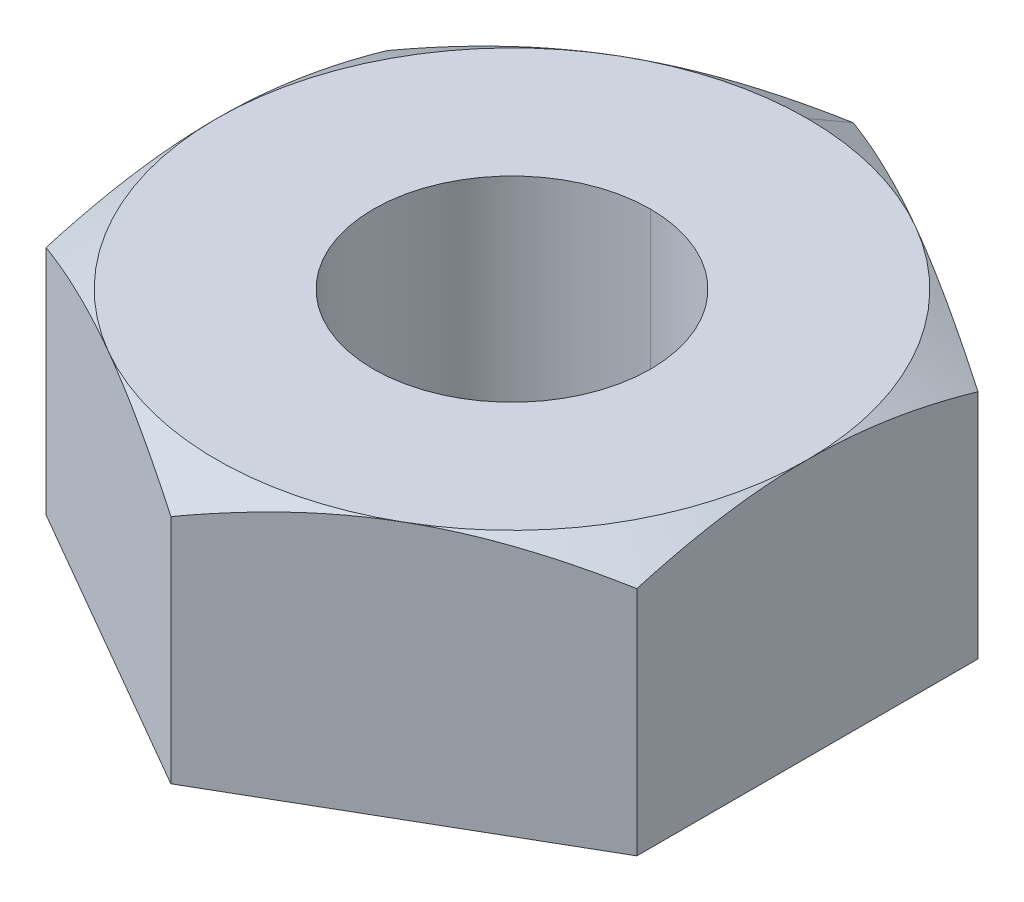
ISO-10303-21;
HEADER;
FILE_DESCRIPTION(('STEP AP214'),'2;1');
FILE_NAME('part.step','',(''),(''),'','','');
FILE_SCHEMA(('AUTOMOTIVE_DESIGN { 1 0 10303 214 1 1 1 1 }'));
ENDSEC;
DATA;
#1=APPLICATION_CONTEXT('core data for automotive mechanical design processes');
#2=APPLICATION_PROTOCOL_DEFINITION('international standard','automotive_design',2000,#1);
#3=PRODUCT_CONTEXT('',#1,'mechanical');
#4=PRODUCT('Part','Part','',(#3));
#5=PRODUCT_RELATED_PRODUCT_CATEGORY('part','',(#4));
#6=PRODUCT_DEFINITION_FORMATION('','',#4);
#7=PRODUCT_DEFINITION_CONTEXT('part definition',#1,'design');
#8=PRODUCT_DEFINITION('design','',#6,#7);
#9=PRODUCT_DEFINITION_SHAPE('','',#8);
#10=(LENGTH_UNIT() NAMED_UNIT(*) SI_UNIT(.MILLI.,.METRE.));
#11=(NAMED_UNIT(*) PLANE_ANGLE_UNIT() SI_UNIT($,.RADIAN.));
#12=(NAMED_UNIT(*) SI_UNIT($,.STERADIAN.) SOLID_ANGLE_UNIT());
#13=UNCERTAINTY_MEASURE_WITH_UNIT(LENGTH_MEASURE(1.E-05),#10,'distance_accuracy_value','');
#14=(GEOMETRIC_REPRESENTATION_CONTEXT(3) GLOBAL_UNCERTAINTY_ASSIGNED_CONTEXT((#13)) GLOBAL_UNIT_ASSIGNED_CONTEXT((#10,
#11,#12)) REPRESENTATION_CONTEXT('',''));
#15=CARTESIAN_POINT('',(0.,0.,0.));
#16=DIRECTION('',(0.,0.,1.));
#17=DIRECTION('',(1.,0.,0.));
#18=AXIS2_PLACEMENT_3D('',#15,#16,#17);
#19=CARTESIAN_POINT('',(0.,2.4,0.));
#20=DIRECTION('',(0.,-1.,0.));
#21=DIRECTION('',(0.,0.,-1.));
#22=AXIS2_PLACEMENT_3D('',#19,#20,#21);
#23=CONICAL_SURFACE('',#22,2.75,1.0471975511966);
#24=CARTESIAN_POINT('',(-1.375,2.4,2.38156986040721));
#25=CARTESIAN_POINT('',(-1.71537571429185,2.4,2.1850538501352));
#26=CARTESIAN_POINT('',(-2.07042661145691,2.33369548248392,1.98006511908093));
#27=CARTESIAN_POINT('',(-2.39248072027173,2.27355300018198,1.79412709266307));
#28=CARTESIAN_POINT('',(-2.75,2.15437990693814,1.58771324027148));
#29=B_SPLINE_CURVE_WITH_KNOTS('',2,(#24,#25,#26,#27,#28),.UNSPECIFIED.,.F.,.F.,(3,2,3),(0.,0.5,
1.),.UNSPECIFIED.);
#30=CARTESIAN_POINT('',(-1.375,2.4,2.38156986040721));
#31=VERTEX_POINT('',#30);
#32=CARTESIAN_POINT('',(-2.75,2.15437990693814,1.58771324027147));
#33=VERTEX_POINT('',#32);
#34=EDGE_CURVE('E155',#31,#33,#29,.T.);
#35=ORIENTED_EDGE('',*,*,#34,.F.);
#36=CARTESIAN_POINT('',(0.,2.4,0.));
#37=DIRECTION('',(0.,-1.,0.));
#38=DIRECTION('',(0.,0.,1.));
#39=AXIS2_PLACEMENT_3D('',#36,#37,#38);
#40=CIRCLE('',#39,2.75);
#41=CARTESIAN_POINT('',(-2.75,2.4,0.));
#42=VERTEX_POINT('',#41);
#43=EDGE_CURVE('E524',#31,#42,#40,.T.);
#44=ORIENTED_EDGE('',*,*,#43,.T.);
#45=CARTESIAN_POINT('',(-2.75,2.15437990693814,1.58771324027148));
#46=CARTESIAN_POINT('',(-2.75,2.27295430093824,1.17695949050172));
#47=CARTESIAN_POINT('',(-2.75,2.33325446010761,0.805730454794825));
#48=CARTESIAN_POINT('',(-2.75,2.4,0.394821383354505));
#49=CARTESIAN_POINT('',(-2.75,2.4,0.));
#50=B_SPLINE_CURVE_WITH_KNOTS('',2,(#45,#46,#47,#48,#49),.UNSPECIFIED.,.F.,.F.,(3,2,3),(0.,0.5,
1.),.UNSPECIFIED.);
#51=EDGE_CURVE('E274',#33,#42,#50,.T.);
#52=ORIENTED_EDGE('',*,*,#51,.F.);
#53=EDGE_LOOP('',(#35,#44,#52));
#54=FACE_BOUND('',#53,.T.);
#55=ADVANCED_FACE('F16',(#54),#23,.T.);
#56=CARTESIAN_POINT('',(0.,2.4,0.));
#57=DIRECTION('',(0.,-1.,0.));
#58=DIRECTION('',(0.,0.,-1.));
#59=AXIS2_PLACEMENT_3D('',#56,#57,#58);
#60=CONICAL_SURFACE('',#59,2.75,1.0471975511966);
#61=CARTESIAN_POINT('',(0.,2.4,0.));
#62=DIRECTION('',(0.,-1.,0.));
#63=DIRECTION('',(0.,0.,1.));
#64=AXIS2_PLACEMENT_3D('',#61,#62,#63);
#65=CIRCLE('',#64,2.75);
#66=CARTESIAN_POINT('',(-1.375,2.4,-2.38156986040721));
#67=VERTEX_POINT('',#66);
#68=EDGE_CURVE('E329',#42,#67,#65,.T.);
#69=ORIENTED_EDGE('',*,*,#68,.T.);
#70=CARTESIAN_POINT('',(-2.75,2.15437990693814,-1.58771324027147));
#71=CARTESIAN_POINT('',(-2.01313972082094,2.4,-2.01313972081064));
#72=CARTESIAN_POINT('',(-1.375,2.4,-2.3815698604072));
#73=B_SPLINE_CURVE_WITH_KNOTS('',2,(#70,#71,#72),.UNSPECIFIED.,.F.,.F.,(3,3),(0.,1.),.UNSPECIFIED.);
#74=CARTESIAN_POINT('',(-2.75,2.15437990693814,-1.58771324027146));
#75=VERTEX_POINT('',#74);
#76=EDGE_CURVE('E289',#75,#67,#73,.T.);
#77=ORIENTED_EDGE('',*,*,#76,.F.);
#78=CARTESIAN_POINT('',(-2.75,2.4,0.));
#79=CARTESIAN_POINT('',(-2.75,2.4,-0.391588689466018));
#80=CARTESIAN_POINT('',(-2.75,2.33419260667332,-0.799932157876207));
#81=CARTESIAN_POINT('',(-2.75,2.27403577461546,-1.17321315578982));
#82=CARTESIAN_POINT('',(-2.75,2.15437990693814,-1.58771324027147));
#83=B_SPLINE_CURVE_WITH_KNOTS('',2,(#78,#79,#80,#81,#82),.UNSPECIFIED.,.F.,.F.,(3,2,3),(0.,0.5,
1.),.UNSPECIFIED.);
#84=EDGE_CURVE('E172',#42,#75,#83,.T.);
#85=ORIENTED_EDGE('',*,*,#84,.F.);
#86=EDGE_LOOP('',(#69,#77,#85));
#87=FACE_BOUND('',#86,.T.);
#88=ADVANCED_FACE('F18',(#87),#60,.T.);
#89=CARTESIAN_POINT('',(0.,2.4,0.));
#90=DIRECTION('',(0.,-1.,0.));
#91=DIRECTION('',(0.,0.,-1.));
#92=AXIS2_PLACEMENT_3D('',#89,#90,#91);
#93=CONICAL_SURFACE('',#92,2.75,1.0471975511966);
#94=DIRECTION('',(0.,-0.5,-0.866025403784442));
#95=VECTOR('',#94,1.);
#96=CARTESIAN_POINT('',(0.,2.4,-2.75));
#97=LINE('',#96,#95);
#98=CARTESIAN_POINT('',(0.,2.4,-2.75));
#99=VERTEX_POINT('',#98);
#100=CARTESIAN_POINT('',(0.,2.15437990693814,-3.17542648054294));
#101=VERTEX_POINT('',#100);
#102=EDGE_CURVE('E323',#99,#101,#97,.T.);
#103=ORIENTED_EDGE('',*,*,#102,.F.);
#104=CARTESIAN_POINT('',(0.,2.4,0.));
#105=DIRECTION('',(0.,-1.,0.));
#106=DIRECTION('',(0.,0.,1.));
#107=AXIS2_PLACEMENT_3D('',#104,#105,#106);
#108=CIRCLE('',#107,2.75);
#109=CARTESIAN_POINT('',(1.375,2.4,-2.38156986040721));
#110=VERTEX_POINT('',#109);
#111=EDGE_CURVE('E330',#99,#110,#108,.T.);
#112=ORIENTED_EDGE('',*,*,#111,.T.);
#113=CARTESIAN_POINT('',(0.,2.15437990693814,-3.17542648054294));
#114=CARTESIAN_POINT('',(0.736860279179051,2.4,-2.75000000000377));
#115=CARTESIAN_POINT('',(1.375,2.4,-2.3815698604072));
#116=B_SPLINE_CURVE_WITH_KNOTS('',2,(#113,#114,#115),.UNSPECIFIED.,.F.,.F.,(3,3),(0.,1.),.UNSPECIFIED.);
#117=EDGE_CURVE('E400',#101,#110,#116,.T.);
#118=ORIENTED_EDGE('',*,*,#117,.F.);
#119=EDGE_LOOP('',(#103,#112,#118));
#120=FACE_BOUND('',#119,.T.);
#121=ADVANCED_FACE('F373',(#120),#93,.T.);
#122=CARTESIAN_POINT('',(0.,2.4,0.));
#123=DIRECTION('',(0.,-1.,0.));
#124=DIRECTION('',(0.,0.,-1.));
#125=AXIS2_PLACEMENT_3D('',#122,#123,#124);
#126=CONICAL_SURFACE('',#125,2.75,1.0471975511966);
#127=CARTESIAN_POINT('',(0.,2.4,0.));
#128=DIRECTION('',(0.,-1.,0.));
#129=DIRECTION('',(0.,0.,-1.));
#130=AXIS2_PLACEMENT_3D('',#127,#128,#129);
#131=CIRCLE('',#130,2.75);
#132=CARTESIAN_POINT('',(2.75,2.4,0.));
#133=VERTEX_POINT('',#132);
#134=EDGE_CURVE('E45',#110,#133,#131,.T.);
#135=ORIENTED_EDGE('',*,*,#134,.T.);
#136=CARTESIAN_POINT('',(2.75,2.15437990693814,-1.58771324027147));
#137=CARTESIAN_POINT('',(2.75,2.27386433970072,-1.17380702375488));
#138=CARTESIAN_POINT('',(2.75,2.33419260722208,-0.799932154473225));
#139=CARTESIAN_POINT('',(2.75,2.4,-0.39210127545956));
#140=CARTESIAN_POINT('',(2.75,2.4,0.));
#141=B_SPLINE_CURVE_WITH_KNOTS('',2,(#136,#137,#138,#139,#140),.UNSPECIFIED.,.F.,.F.,(3,2,3),
(0.,0.5,1.),.UNSPECIFIED.);
#142=CARTESIAN_POINT('',(2.75,2.15437990693814,-1.58771324027146));
#143=VERTEX_POINT('',#142);
#144=EDGE_CURVE('E468',#143,#133,#141,.T.);
#145=ORIENTED_EDGE('',*,*,#144,.F.);
#146=CARTESIAN_POINT('',(1.375,2.4,-2.3815698604072));
#147=CARTESIAN_POINT('',(1.7153757142917,2.4,-2.18505385013528));
#148=CARTESIAN_POINT('',(2.07042661145691,2.33369548248392,-1.98006511908093));
#149=CARTESIAN_POINT('',(2.39248072027156,2.27355300018203,-1.79412709266317));
#150=CARTESIAN_POINT('',(2.75,2.15437990693814,-1.58771324027147));
#151=B_SPLINE_CURVE_WITH_KNOTS('',2,(#146,#147,#148,#149,#150),.UNSPECIFIED.,.F.,.F.,(3,2,3),
(0.,0.5,1.),.UNSPECIFIED.);
#152=EDGE_CURVE('E349',#110,#143,#151,.T.);
#153=ORIENTED_EDGE('',*,*,#152,.F.);
#154=EDGE_LOOP('',(#135,#145,#153));
#155=FACE_BOUND('',#154,.T.);
#156=ADVANCED_FACE('F364',(#155),#126,.T.);
#157=CARTESIAN_POINT('',(0.,2.4,0.));
#158=DIRECTION('',(0.,-1.,0.));
#159=DIRECTION('',(0.,0.,-1.));
#160=AXIS2_PLACEMENT_3D('',#157,#158,#159);
#161=CONICAL_SURFACE('',#160,2.75,1.0471975511966);
#162=CARTESIAN_POINT('',(2.75,2.4,0.));
#163=CARTESIAN_POINT('',(2.75,2.4,0.394308885946013));
#164=CARTESIAN_POINT('',(2.75,2.33325446067467,0.805730451301709));
#165=CARTESIAN_POINT('',(2.75,2.273125789635,1.17636543623032));
#166=CARTESIAN_POINT('',(2.75,2.15437990693814,1.58771324027147));
#167=B_SPLINE_CURVE_WITH_KNOTS('',2,(#162,#163,#164,#165,#166),.UNSPECIFIED.,.F.,.F.,(3,2,3),
(0.,0.5,1.),.UNSPECIFIED.);
#168=CARTESIAN_POINT('',(2.75,2.15437990693814,1.58771324027147));
#169=VERTEX_POINT('',#168);
#170=EDGE_CURVE('E477',#133,#169,#167,.T.);
#171=ORIENTED_EDGE('',*,*,#170,.F.);
#172=CARTESIAN_POINT('',(0.,2.4,0.));
#173=DIRECTION('',(0.,-1.,0.));
#174=DIRECTION('',(0.,0.,1.));
#175=AXIS2_PLACEMENT_3D('',#172,#173,#174);
#176=CIRCLE('',#175,2.75);
#177=CARTESIAN_POINT('',(1.375,2.4,2.38156986040721));
#178=VERTEX_POINT('',#177);
#179=EDGE_CURVE('E498',#133,#178,#176,.T.);
#180=ORIENTED_EDGE('',*,*,#179,.T.);
#181=CARTESIAN_POINT('',(2.75,2.15437990693814,1.58771324027148));
#182=CARTESIAN_POINT('',(2.01313972082094,2.4,2.01313972081065));
#183=CARTESIAN_POINT('',(1.375,2.4,2.38156986040721));
#184=B_SPLINE_CURVE_WITH_KNOTS('',2,(#181,#182,#183),.UNSPECIFIED.,.F.,.F.,(3,3),(0.,1.),.UNSPECIFIED.);
#185=EDGE_CURVE('E137',#169,#178,#184,.T.);
#186=ORIENTED_EDGE('',*,*,#185,.F.);
#187=EDGE_LOOP('',(#171,#180,#186));
#188=FACE_BOUND('',#187,.T.);
#189=ADVANCED_FACE('F218',(#188),#161,.T.);
#190=CARTESIAN_POINT('',(0.,2.4,0.));
#191=DIRECTION('',(0.,-1.,0.));
#192=DIRECTION('',(0.,0.,-1.));
#193=AXIS2_PLACEMENT_3D('',#190,#191,#192);
#194=CONICAL_SURFACE('',#193,2.75,1.0471975511966);
#195=CARTESIAN_POINT('',(1.375,2.4,2.38156986040721));
#196=CARTESIAN_POINT('',(1.03462428570809,2.4,2.57808587067926));
#197=CARTESIAN_POINT('',(0.679573388543091,2.33369548248392,2.78307460173349));
#198=CARTESIAN_POINT('',(0.357519279728201,2.27355300018195,2.96901262815139));
#199=CARTESIAN_POINT('',(0.,2.15437990693814,3.17542648054294));
#200=B_SPLINE_CURVE_WITH_KNOTS('',2,(#195,#196,#197,#198,#199),.UNSPECIFIED.,.F.,.F.,(3,2,3),
(0.,0.5,1.),.UNSPECIFIED.);
#201=CARTESIAN_POINT('',(0.,2.15437990693814,3.17542648054294));
#202=VERTEX_POINT('',#201);
#203=EDGE_CURVE('E128',#178,#202,#200,.T.);
#204=ORIENTED_EDGE('',*,*,#203,.F.);
#205=CARTESIAN_POINT('',(0.,2.4,0.));
#206=DIRECTION('',(0.,-1.,0.));
#207=DIRECTION('',(0.,0.,1.));
#208=AXIS2_PLACEMENT_3D('',#205,#206,#207);
#209=CIRCLE('',#208,2.75);
#210=EDGE_CURVE('E150',#178,#31,#209,.T.);
#211=ORIENTED_EDGE('',*,*,#210,.T.);
#212=CARTESIAN_POINT('',(0.,2.15437990693814,3.17542648054295));
#213=CARTESIAN_POINT('',(-0.73686027917906,2.4,2.75000000000377));
#214=CARTESIAN_POINT('',(-1.375,2.4,2.38156986040721));
#215=B_SPLINE_CURVE_WITH_KNOTS('',2,(#212,#213,#214),.UNSPECIFIED.,.F.,.F.,(3,3),(0.,1.),.UNSPECIFIED.);
#216=EDGE_CURVE('E146',#202,#31,#215,.T.);
#217=ORIENTED_EDGE('',*,*,#216,.F.);
#218=EDGE_LOOP('',(#204,#211,#217));
#219=FACE_BOUND('',#218,.T.);
#220=ADVANCED_FACE('F148',(#219),#194,.T.);
#221=CARTESIAN_POINT('',(0.,0.,0.));
#222=DIRECTION('',(0.,1.,0.));
#223=DIRECTION('',(0.,0.,1.));
#224=AXIS2_PLACEMENT_3D('',#221,#222,#223);
#225=CYLINDRICAL_SURFACE('',#224,1.29);
#226=DIRECTION('',(0.,1.,0.));
#227=VECTOR('',#226,1.);
#228=CARTESIAN_POINT('',(0.,0.,-1.29));
#229=LINE('',#228,#227);
#230=CARTESIAN_POINT('',(0.,0.,-1.29));
#231=VERTEX_POINT('',#230);
#232=CARTESIAN_POINT('',(0.,2.4,-1.29));
#233=VERTEX_POINT('',#232);
#234=EDGE_CURVE('E465',#231,#233,#229,.T.);
#235=ORIENTED_EDGE('',*,*,#234,.F.);
#236=CARTESIAN_POINT('',(0.,0.,0.));
#237=DIRECTION('',(0.,1.,0.));
#238=DIRECTION('',(0.,0.,1.));
#239=AXIS2_PLACEMENT_3D('',#236,#237,#238);
#240=CIRCLE('',#239,1.29);
#241=CARTESIAN_POINT('',(0.,0.,1.29));
#242=VERTEX_POINT('',#241);
#243=EDGE_CURVE('E10',#242,#231,#240,.T.);
#244=ORIENTED_EDGE('',*,*,#243,.F.);
#245=DIRECTION('',(0.,1.,0.));
#246=VECTOR('',#245,1.);
#247=CARTESIAN_POINT('',(0.,0.,1.29));
#248=LINE('',#247,#246);
#249=CARTESIAN_POINT('',(0.,2.4,1.29));
#250=VERTEX_POINT('',#249);
#251=EDGE_CURVE('E414',#242,#250,#248,.T.);
#252=ORIENTED_EDGE('',*,*,#251,.T.);
#253=CARTESIAN_POINT('',(0.,2.4,0.));
#254=DIRECTION('',(0.,1.,0.));
#255=DIRECTION('',(0.,0.,1.));
#256=AXIS2_PLACEMENT_3D('',#253,#254,#255);
#257=CIRCLE('',#256,1.29);
#258=EDGE_CURVE('E30',#250,#233,#257,.T.);
#259=ORIENTED_EDGE('',*,*,#258,.T.);
#260=EDGE_LOOP('',(#235,#244,#252,#259));
#261=FACE_BOUND('',#260,.T.);
#262=ADVANCED_FACE('F217',(#261),#225,.F.);
#263=CARTESIAN_POINT('',(0.,0.,0.));
#264=DIRECTION('',(0.,1.,0.));
#265=DIRECTION('',(1.,0.,0.));
#266=AXIS2_PLACEMENT_3D('',#263,#264,#265);
#267=PLANE('',#266);
#268=ORIENTED_EDGE('',*,*,#243,.T.);
#269=CARTESIAN_POINT('',(0.,0.,0.));
#270=DIRECTION('',(0.,1.,0.));
#271=DIRECTION('',(0.,0.,1.));
#272=AXIS2_PLACEMENT_3D('',#269,#270,#271);
#273=CIRCLE('',#272,1.29);
#274=EDGE_CURVE('E326',#231,#242,#273,.T.);
#275=ORIENTED_EDGE('',*,*,#274,.T.);
#276=EDGE_LOOP('',(#268,#275));
#277=FACE_BOUND('',#276,.T.);
#278=DIRECTION('',(-0.866025403784439,0.,-0.5));
#279=VECTOR('',#278,1.);
#280=CARTESIAN_POINT('',(2.75,0.,-1.58771324027147));
#281=LINE('',#280,#279);
#282=CARTESIAN_POINT('',(2.75,0.,-1.58771324027147));
#283=VERTEX_POINT('',#282);
#284=CARTESIAN_POINT('',(0.,0.,-3.17542648054294));
#285=VERTEX_POINT('',#284);
#286=EDGE_CURVE('E389',#283,#285,#281,.T.);
#287=ORIENTED_EDGE('',*,*,#286,.F.);
#288=DIRECTION('',(0.,0.,-1.));
#289=VECTOR('',#288,1.);
#290=CARTESIAN_POINT('',(2.75,0.,1.58771324027147));
#291=LINE('',#290,#289);
#292=CARTESIAN_POINT('',(2.75,0.,1.58771324027147));
#293=VERTEX_POINT('',#292);
#294=EDGE_CURVE('E452',#293,#283,#291,.T.);
#295=ORIENTED_EDGE('',*,*,#294,.F.);
#296=DIRECTION('',(0.866025403784439,0.,-0.5));
#297=VECTOR('',#296,1.);
#298=CARTESIAN_POINT('',(0.,0.,3.17542648054295));
#299=LINE('',#298,#297);
#300=CARTESIAN_POINT('',(0.,0.,3.17542648054295));
#301=VERTEX_POINT('',#300);
#302=EDGE_CURVE('E142',#301,#293,#299,.T.);
#303=ORIENTED_EDGE('',*,*,#302,.F.);
#304=DIRECTION('',(0.866025403784439,0.,0.5));
#305=VECTOR('',#304,1.);
#306=CARTESIAN_POINT('',(-2.75,0.,1.58771324027147));
#307=LINE('',#306,#305);
#308=CARTESIAN_POINT('',(-2.75,0.,1.58771324027147));
#309=VERTEX_POINT('',#308);
#310=EDGE_CURVE('E162',#309,#301,#307,.T.);
#311=ORIENTED_EDGE('',*,*,#310,.F.);
#312=DIRECTION('',(0.,0.,1.));
#313=VECTOR('',#312,1.);
#314=CARTESIAN_POINT('',(-2.75,0.,-1.58771324027147));
#315=LINE('',#314,#313);
#316=CARTESIAN_POINT('',(-2.75,0.,-1.58771324027147));
#317=VERTEX_POINT('',#316);
#318=EDGE_CURVE('E164',#317,#309,#315,.T.);
#319=ORIENTED_EDGE('',*,*,#318,.F.);
#320=DIRECTION('',(-0.866025403784439,0.,0.5));
#321=VECTOR('',#320,1.);
#322=CARTESIAN_POINT('',(0.,0.,-3.17542648054294));
#323=LINE('',#322,#321);
#324=EDGE_CURVE('E453',#285,#317,#323,.T.);
#325=ORIENTED_EDGE('',*,*,#324,.F.);
#326=EDGE_LOOP('',(#287,#295,#303,#311,#319,#325));
#327=FACE_BOUND('',#326,.T.);
#328=ADVANCED_FACE('F254',(#277,#327),#267,.F.);
#329=CARTESIAN_POINT('',(0.,2.4,0.));
#330=DIRECTION('',(0.,1.,0.));
#331=DIRECTION('',(1.,0.,0.));
#332=AXIS2_PLACEMENT_3D('',#329,#330,#331);
#333=PLANE('',#332);
#334=ORIENTED_EDGE('',*,*,#258,.F.);
#335=CARTESIAN_POINT('',(0.,2.4,0.));
#336=DIRECTION('',(0.,1.,0.));
#337=DIRECTION('',(0.,0.,1.));
#338=AXIS2_PLACEMENT_3D('',#335,#336,#337);
#339=CIRCLE('',#338,1.29);
#340=EDGE_CURVE('E423',#233,#250,#339,.T.);
#341=ORIENTED_EDGE('',*,*,#340,.F.);
#342=EDGE_LOOP('',(#334,#341));
#343=FACE_BOUND('',#342,.T.);
#344=ORIENTED_EDGE('',*,*,#43,.F.);
#345=ORIENTED_EDGE('',*,*,#210,.F.);
#346=ORIENTED_EDGE('',*,*,#179,.F.);
#347=ORIENTED_EDGE('',*,*,#134,.F.);
#348=ORIENTED_EDGE('',*,*,#111,.F.);
#349=CARTESIAN_POINT('',(0.,2.4,0.));
#350=DIRECTION('',(0.,-1.,0.));
#351=DIRECTION('',(0.,0.,1.));
#352=AXIS2_PLACEMENT_3D('',#349,#350,#351);
#353=CIRCLE('',#352,2.75);
#354=EDGE_CURVE('E321',#67,#99,#353,.T.);
#355=ORIENTED_EDGE('',*,*,#354,.F.);
#356=ORIENTED_EDGE('',*,*,#68,.F.);
#357=EDGE_LOOP('',(#344,#345,#346,#347,#348,#355,#356));
#358=FACE_BOUND('',#357,.T.);
#359=ADVANCED_FACE('F328',(#343,#358),#333,.T.);
#360=CARTESIAN_POINT('',(2.75,2.4,1.58771324027147));
#361=DIRECTION('',(-1.,0.,0.));
#362=DIRECTION('',(0.,0.,1.));
#363=AXIS2_PLACEMENT_3D('',#360,#361,#362);
#364=PLANE('',#363);
#365=DIRECTION('',(0.,-1.,0.));
#366=VECTOR('',#365,1.);
#367=CARTESIAN_POINT('',(2.75,2.4,-1.58771324027147));
#368=LINE('',#367,#366);
#369=EDGE_CURVE('E382',#143,#283,#368,.T.);
#370=ORIENTED_EDGE('',*,*,#369,.F.);
#371=ORIENTED_EDGE('',*,*,#144,.T.);
#372=ORIENTED_EDGE('',*,*,#170,.T.);
#373=DIRECTION('',(0.,-1.,0.));
#374=VECTOR('',#373,1.);
#375=CARTESIAN_POINT('',(2.75,2.4,1.58771324027147));
#376=LINE('',#375,#374);
#377=EDGE_CURVE('E505',#169,#293,#376,.T.);
#378=ORIENTED_EDGE('',*,*,#377,.T.);
#379=ORIENTED_EDGE('',*,*,#294,.T.);
#380=EDGE_LOOP('',(#370,#371,#372,#378,#379));
#381=FACE_BOUND('',#380,.T.);
#382=ADVANCED_FACE('F192',(#381),#364,.F.);
#383=CARTESIAN_POINT('',(0.,2.4,3.17542648054295));
#384=DIRECTION('',(-0.5,0.,-0.866025403784439));
#385=DIRECTION('',(-0.866025403784439,0.,0.5));
#386=AXIS2_PLACEMENT_3D('',#383,#384,#385);
#387=PLANE('',#386);
#388=ORIENTED_EDGE('',*,*,#377,.F.);
#389=ORIENTED_EDGE('',*,*,#185,.T.);
#390=ORIENTED_EDGE('',*,*,#203,.T.);
#391=DIRECTION('',(0.,-1.,0.));
#392=VECTOR('',#391,1.);
#393=CARTESIAN_POINT('',(0.,2.4,3.17542648054295));
#394=LINE('',#393,#392);
#395=EDGE_CURVE('E135',#202,#301,#394,.T.);
#396=ORIENTED_EDGE('',*,*,#395,.T.);
#397=ORIENTED_EDGE('',*,*,#302,.T.);
#398=EDGE_LOOP('',(#388,#389,#390,#396,#397));
#399=FACE_BOUND('',#398,.T.);
#400=ADVANCED_FACE('F132',(#399),#387,.F.);
#401=CARTESIAN_POINT('',(-2.75,2.4,1.58771324027147));
#402=DIRECTION('',(0.5,0.,-0.866025403784439));
#403=DIRECTION('',(0.,-1.,0.));
#404=AXIS2_PLACEMENT_3D('',#401,#402,#403);
#405=PLANE('',#404);
#406=ORIENTED_EDGE('',*,*,#395,.F.);
#407=ORIENTED_EDGE('',*,*,#216,.T.);
#408=ORIENTED_EDGE('',*,*,#34,.T.);
#409=DIRECTION('',(0.,-1.,0.));
#410=VECTOR('',#409,1.);
#411=CARTESIAN_POINT('',(-2.75,2.4,1.58771324027147));
#412=LINE('',#411,#410);
#413=EDGE_CURVE('E455',#33,#309,#412,.T.);
#414=ORIENTED_EDGE('',*,*,#413,.T.);
#415=ORIENTED_EDGE('',*,*,#310,.T.);
#416=EDGE_LOOP('',(#406,#407,#408,#414,#415));
#417=FACE_BOUND('',#416,.T.);
#418=ADVANCED_FACE('F159',(#417),#405,.F.);
#419=CARTESIAN_POINT('',(-2.75,2.4,-1.58771324027147));
#420=DIRECTION('',(1.,0.,0.));
#421=DIRECTION('',(0.,1.,0.));
#422=AXIS2_PLACEMENT_3D('',#419,#420,#421);
#423=PLANE('',#422);
#424=ORIENTED_EDGE('',*,*,#413,.F.);
#425=ORIENTED_EDGE('',*,*,#51,.T.);
#426=ORIENTED_EDGE('',*,*,#84,.T.);
#427=DIRECTION('',(0.,-1.,0.));
#428=VECTOR('',#427,1.);
#429=CARTESIAN_POINT('',(-2.75,2.4,-1.58771324027147));
#430=LINE('',#429,#428);
#431=EDGE_CURVE('E397',#75,#317,#430,.T.);
#432=ORIENTED_EDGE('',*,*,#431,.T.);
#433=ORIENTED_EDGE('',*,*,#318,.T.);
#434=EDGE_LOOP('',(#424,#425,#426,#432,#433));
#435=FACE_BOUND('',#434,.T.);
#436=ADVANCED_FACE('F243',(#435),#423,.F.);
#437=CARTESIAN_POINT('',(0.,2.4,-3.17542648054294));
#438=DIRECTION('',(0.5,0.,0.866025403784439));
#439=DIRECTION('',(0.,-1.,0.));
#440=AXIS2_PLACEMENT_3D('',#437,#438,#439);
#441=PLANE('',#440);
#442=ORIENTED_EDGE('',*,*,#431,.F.);
#443=ORIENTED_EDGE('',*,*,#76,.T.);
#444=CARTESIAN_POINT('',(-1.375,2.4,-2.3815698604072));
#445=CARTESIAN_POINT('',(-1.034624285709,2.4,-2.57808587067873));
#446=CARTESIAN_POINT('',(-0.679573388543089,2.33369548248392,-2.78307460173348));
#447=CARTESIAN_POINT('',(-0.357519279729257,2.27355300018231,-2.96901262815077));
#448=CARTESIAN_POINT('',(0.,2.15437990693814,-3.17542648054294));
#449=B_SPLINE_CURVE_WITH_KNOTS('',2,(#444,#445,#446,#447,#448),.UNSPECIFIED.,.F.,.F.,(3,2,3),
(0.,0.5,1.),.UNSPECIFIED.);
#450=EDGE_CURVE('E318',#67,#101,#449,.T.);
#451=ORIENTED_EDGE('',*,*,#450,.T.);
#452=DIRECTION('',(0.,-1.,0.));
#453=VECTOR('',#452,1.);
#454=CARTESIAN_POINT('',(0.,2.4,-3.17542648054294));
#455=LINE('',#454,#453);
#456=EDGE_CURVE('E405',#101,#285,#455,.T.);
#457=ORIENTED_EDGE('',*,*,#456,.T.);
#458=ORIENTED_EDGE('',*,*,#324,.T.);
#459=EDGE_LOOP('',(#442,#443,#451,#457,#458));
#460=FACE_BOUND('',#459,.T.);
#461=ADVANCED_FACE('F253',(#460),#441,.F.);
#462=CARTESIAN_POINT('',(2.75,2.4,-1.58771324027147));
#463=DIRECTION('',(-0.5,0.,0.866025403784439));
#464=DIRECTION('',(0.,1.,0.));
#465=AXIS2_PLACEMENT_3D('',#462,#463,#464);
#466=PLANE('',#465);
#467=ORIENTED_EDGE('',*,*,#456,.F.);
#468=ORIENTED_EDGE('',*,*,#117,.T.);
#469=ORIENTED_EDGE('',*,*,#152,.T.);
#470=ORIENTED_EDGE('',*,*,#369,.T.);
#471=ORIENTED_EDGE('',*,*,#286,.T.);
#472=EDGE_LOOP('',(#467,#468,#469,#470,#471));
#473=FACE_BOUND('',#472,.T.);
#474=ADVANCED_FACE('F193',(#473),#466,.F.);
#475=CARTESIAN_POINT('',(0.,0.,0.));
#476=DIRECTION('',(0.,1.,0.));
#477=DIRECTION('',(0.,0.,1.));
#478=AXIS2_PLACEMENT_3D('',#475,#476,#477);
#479=CYLINDRICAL_SURFACE('',#478,1.29);
#480=ORIENTED_EDGE('',*,*,#274,.F.);
#481=ORIENTED_EDGE('',*,*,#234,.T.);
#482=ORIENTED_EDGE('',*,*,#340,.T.);
#483=ORIENTED_EDGE('',*,*,#251,.F.);
#484=EDGE_LOOP('',(#480,#481,#482,#483));
#485=FACE_BOUND('',#484,.T.);
#486=ADVANCED_FACE('F645',(#485),#479,.F.);
#487=CARTESIAN_POINT('',(0.,2.4,0.));
#488=DIRECTION('',(0.,-1.,0.));
#489=DIRECTION('',(0.,0.,-1.));
#490=AXIS2_PLACEMENT_3D('',#487,#488,#489);
#491=CONICAL_SURFACE('',#490,2.75,1.0471975511966);
#492=ORIENTED_EDGE('',*,*,#354,.T.);
#493=ORIENTED_EDGE('',*,*,#102,.T.);
#494=ORIENTED_EDGE('',*,*,#450,.F.);
#495=EDGE_LOOP('',(#492,#493,#494));
#496=FACE_BOUND('',#495,.T.);
#497=ADVANCED_FACE('F320',(#496),#491,.T.);
#498=CLOSED_SHELL('',(#55,#88,#121,#156,#189,#220,#262,#328,#359,#382,#400,#418,#436,#461,#474,
#486,#497));
#499=MANIFOLD_SOLID_BREP('B1',#498);
#500=ADVANCED_BREP_SHAPE_REPRESENTATION('',(#18,#499),#14);
#501=SHAPE_DEFINITION_REPRESENTATION(#9,#500);
ENDSEC;
END-ISO-10303-21;
